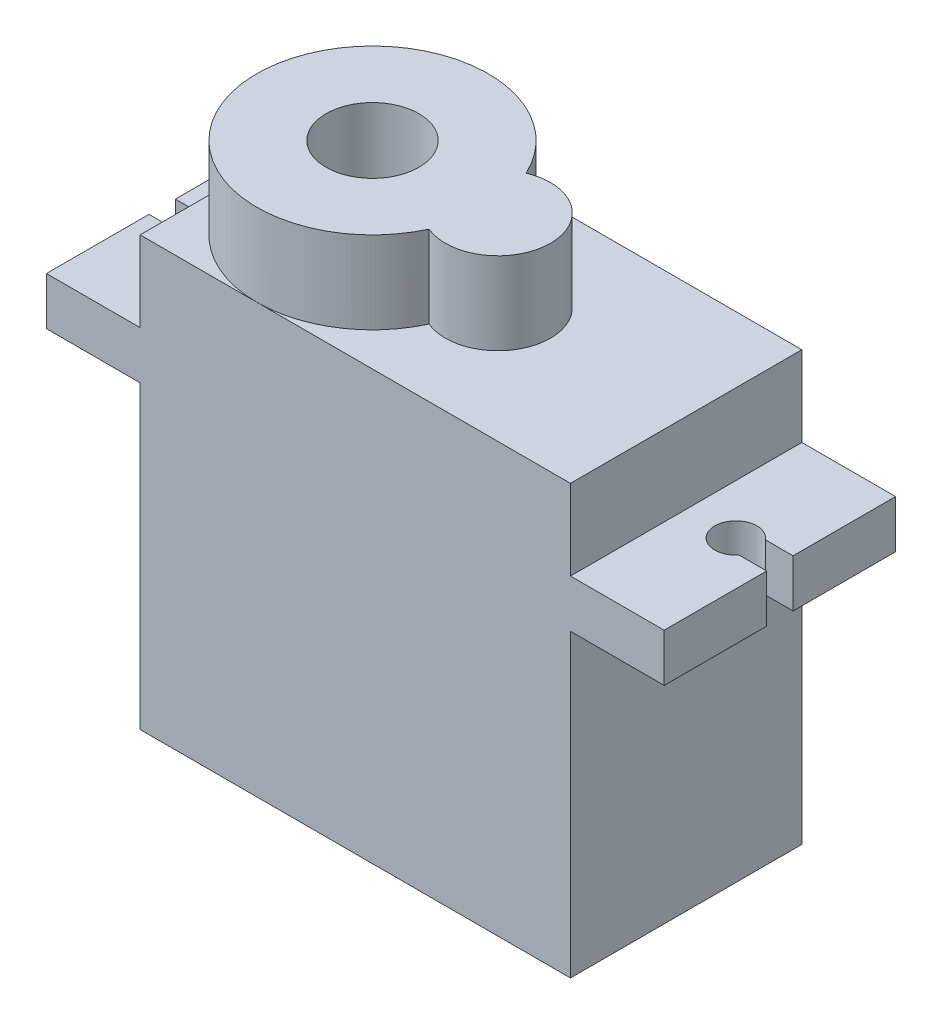
ISO-10303-21;
HEADER;
FILE_DESCRIPTION(('STEP AP214'),'2;1');
FILE_NAME('part.step','',(''),(''),'','','');
FILE_SCHEMA(('AUTOMOTIVE_DESIGN { 1 0 10303 214 1 1 1 1 }'));
ENDSEC;
DATA;
#1=APPLICATION_CONTEXT('core data for automotive mechanical design processes');
#2=APPLICATION_PROTOCOL_DEFINITION('international standard','automotive_design',2000,#1);
#3=PRODUCT_CONTEXT('',#1,'mechanical');
#4=PRODUCT('Part','Part','',(#3));
#5=PRODUCT_RELATED_PRODUCT_CATEGORY('part','',(#4));
#6=PRODUCT_DEFINITION_FORMATION('','',#4);
#7=PRODUCT_DEFINITION_CONTEXT('part definition',#1,'design');
#8=PRODUCT_DEFINITION('design','',#6,#7);
#9=PRODUCT_DEFINITION_SHAPE('','',#8);
#10=(LENGTH_UNIT() NAMED_UNIT(*) SI_UNIT(.MILLI.,.METRE.));
#11=(NAMED_UNIT(*) PLANE_ANGLE_UNIT() SI_UNIT($,.RADIAN.));
#12=(NAMED_UNIT(*) SI_UNIT($,.STERADIAN.) SOLID_ANGLE_UNIT());
#13=UNCERTAINTY_MEASURE_WITH_UNIT(LENGTH_MEASURE(1.E-05),#10,'distance_accuracy_value','');
#14=(GEOMETRIC_REPRESENTATION_CONTEXT(3) GLOBAL_UNCERTAINTY_ASSIGNED_CONTEXT((#13)) GLOBAL_UNIT_ASSIGNED_CONTEXT((#10,
#11,#12)) REPRESENTATION_CONTEXT('',''));
#15=CARTESIAN_POINT('',(0.,0.,0.));
#16=DIRECTION('',(0.,0.,1.));
#17=DIRECTION('',(1.,0.,0.));
#18=AXIS2_PLACEMENT_3D('',#15,#16,#17);
#19=CARTESIAN_POINT('',(0.,44.8,0.));
#20=DIRECTION('',(0.,-1.,0.));
#21=DIRECTION('',(0.,0.,-1.));
#22=AXIS2_PLACEMENT_3D('',#19,#20,#21);
#23=PLANE('',#22);
#24=CARTESIAN_POINT('',(2.81693698852337,44.8,0.));
#25=DIRECTION('',(0.,1.,0.));
#26=DIRECTION('',(0.,0.,1.));
#27=AXIS2_PLACEMENT_3D('',#24,#25,#26);
#28=CIRCLE('',#27,5.5);
#29=CARTESIAN_POINT('',(0.686331496944168,44.8,5.07055423393267));
#30=VERTEX_POINT('',#29);
#31=CARTESIAN_POINT('',(0.686331496944172,44.8,-5.07055423393267));
#32=VERTEX_POINT('',#31);
#33=EDGE_CURVE('E218',#30,#32,#28,.T.);
#34=ORIENTED_EDGE('',*,*,#33,.F.);
#35=CARTESIAN_POINT('',(-10.3,44.8,0.));
#36=DIRECTION('',(0.,1.,0.));
#37=DIRECTION('',(0.,0.,1.));
#38=AXIS2_PLACEMENT_3D('',#35,#36,#37);
#39=CIRCLE('',#38,12.1);
#40=CARTESIAN_POINT('',(-10.3,44.8,12.1));
#41=VERTEX_POINT('',#40);
#42=EDGE_CURVE('E53',#41,#30,#39,.T.);
#43=ORIENTED_EDGE('',*,*,#42,.F.);
#44=DIRECTION('',(1.,0.,0.));
#45=VECTOR('',#44,1.);
#46=CARTESIAN_POINT('',(-22.5,44.8,12.1));
#47=LINE('',#46,#45);
#48=CARTESIAN_POINT('',(22.5,44.8,12.1));
#49=VERTEX_POINT('',#48);
#50=EDGE_CURVE('E371',#41,#49,#47,.T.);
#51=ORIENTED_EDGE('',*,*,#50,.T.);
#52=DIRECTION('',(0.,0.,-1.));
#53=VECTOR('',#52,1.);
#54=CARTESIAN_POINT('',(22.5,44.8,12.1));
#55=LINE('',#54,#53);
#56=CARTESIAN_POINT('',(22.5,44.8,-12.1));
#57=VERTEX_POINT('',#56);
#58=EDGE_CURVE('E359',#49,#57,#55,.T.);
#59=ORIENTED_EDGE('',*,*,#58,.T.);
#60=DIRECTION('',(-1.,0.,0.));
#61=VECTOR('',#60,1.);
#62=CARTESIAN_POINT('',(-22.5,44.8,-12.1));
#63=LINE('',#62,#61);
#64=CARTESIAN_POINT('',(-10.3,44.8,-12.1));
#65=VERTEX_POINT('',#64);
#66=EDGE_CURVE('E365',#57,#65,#63,.T.);
#67=ORIENTED_EDGE('',*,*,#66,.T.);
#68=EDGE_CURVE('E55',#32,#65,#39,.T.);
#69=ORIENTED_EDGE('',*,*,#68,.F.);
#70=EDGE_LOOP('',(#34,#43,#51,#59,#67,#69));
#71=FACE_BOUND('',#70,.T.);
#72=ADVANCED_FACE('F43',(#71),#23,.F.);
#73=CARTESIAN_POINT('',(32.3,0.,0.));
#74=DIRECTION('',(-1.,0.,0.));
#75=DIRECTION('',(0.,0.,-1.));
#76=AXIS2_PLACEMENT_3D('',#73,#74,#75);
#77=PLANE('',#76);
#78=DIRECTION('',(0.,-1.,0.));
#79=VECTOR('',#78,1.);
#80=CARTESIAN_POINT('',(32.3,145.46840788497,1.38103253358551));
#81=LINE('',#80,#79);
#82=CARTESIAN_POINT('',(32.3,36.4,1.38103253358551));
#83=VERTEX_POINT('',#82);
#84=CARTESIAN_POINT('',(32.3,31.4,1.38103253358551));
#85=VERTEX_POINT('',#84);
#86=EDGE_CURVE('E220',#83,#85,#81,.T.);
#87=ORIENTED_EDGE('',*,*,#86,.F.);
#88=DIRECTION('',(0.,0.,-1.));
#89=VECTOR('',#88,1.);
#90=CARTESIAN_POINT('',(32.3,36.4,-12.1));
#91=LINE('',#90,#89);
#92=CARTESIAN_POINT('',(32.3,36.4,12.1));
#93=VERTEX_POINT('',#92);
#94=EDGE_CURVE('E259',#93,#83,#91,.T.);
#95=ORIENTED_EDGE('',*,*,#94,.F.);
#96=DIRECTION('',(0.,1.,0.));
#97=VECTOR('',#96,1.);
#98=CARTESIAN_POINT('',(32.3,31.4,12.1));
#99=LINE('',#98,#97);
#100=CARTESIAN_POINT('',(32.3,31.4,12.1));
#101=VERTEX_POINT('',#100);
#102=EDGE_CURVE('E263',#101,#93,#99,.T.);
#103=ORIENTED_EDGE('',*,*,#102,.F.);
#104=DIRECTION('',(0.,0.,1.));
#105=VECTOR('',#104,1.);
#106=CARTESIAN_POINT('',(32.3,31.4,-12.1));
#107=LINE('',#106,#105);
#108=EDGE_CURVE('E267',#85,#101,#107,.T.);
#109=ORIENTED_EDGE('',*,*,#108,.F.);
#110=EDGE_LOOP('',(#87,#95,#103,#109));
#111=FACE_BOUND('',#110,.T.);
#112=ADVANCED_FACE('F598',(#111),#77,.F.);
#113=CARTESIAN_POINT('',(22.5,44.8,12.1));
#114=DIRECTION('',(-1.,0.,0.));
#115=DIRECTION('',(0.,0.,1.));
#116=AXIS2_PLACEMENT_3D('',#113,#114,#115);
#117=PLANE('',#116);
#118=DIRECTION('',(0.,-1.,0.));
#119=VECTOR('',#118,1.);
#120=CARTESIAN_POINT('',(22.5,44.8,-12.1));
#121=LINE('',#120,#119);
#122=CARTESIAN_POINT('',(22.5,31.4,-12.1));
#123=VERTEX_POINT('',#122);
#124=CARTESIAN_POINT('',(22.5,0.,-12.1));
#125=VERTEX_POINT('',#124);
#126=EDGE_CURVE('E404',#123,#125,#121,.T.);
#127=ORIENTED_EDGE('',*,*,#126,.F.);
#128=DIRECTION('',(0.,0.,1.));
#129=VECTOR('',#128,1.);
#130=CARTESIAN_POINT('',(22.5,31.4,-12.1));
#131=LINE('',#130,#129);
#132=CARTESIAN_POINT('',(22.5,31.4,12.1));
#133=VERTEX_POINT('',#132);
#134=EDGE_CURVE('E258',#123,#133,#131,.T.);
#135=ORIENTED_EDGE('',*,*,#134,.T.);
#136=DIRECTION('',(0.,-1.,0.));
#137=VECTOR('',#136,1.);
#138=CARTESIAN_POINT('',(22.5,44.8,12.1));
#139=LINE('',#138,#137);
#140=CARTESIAN_POINT('',(22.5,0.,12.1));
#141=VERTEX_POINT('',#140);
#142=EDGE_CURVE('E376',#133,#141,#139,.T.);
#143=ORIENTED_EDGE('',*,*,#142,.T.);
#144=DIRECTION('',(0.,0.,-1.));
#145=VECTOR('',#144,1.);
#146=CARTESIAN_POINT('',(22.5,0.,12.1));
#147=LINE('',#146,#145);
#148=EDGE_CURVE('E358',#141,#125,#147,.T.);
#149=ORIENTED_EDGE('',*,*,#148,.T.);
#150=EDGE_LOOP('',(#127,#135,#143,#149));
#151=FACE_BOUND('',#150,.T.);
#152=ADVANCED_FACE('F502',(#151),#117,.F.);
#153=CARTESIAN_POINT('',(-32.3,0.,0.));
#154=DIRECTION('',(1.,0.,0.));
#155=DIRECTION('',(0.,0.,-1.));
#156=AXIS2_PLACEMENT_3D('',#153,#154,#155);
#157=PLANE('',#156);
#158=DIRECTION('',(0.,-1.,0.));
#159=VECTOR('',#158,1.);
#160=CARTESIAN_POINT('',(-32.3,129.905681645556,-1.38103253358552));
#161=LINE('',#160,#159);
#162=CARTESIAN_POINT('',(-32.3,36.4,-1.38103253358552));
#163=VERTEX_POINT('',#162);
#164=CARTESIAN_POINT('',(-32.3,31.4,-1.38103253358552));
#165=VERTEX_POINT('',#164);
#166=EDGE_CURVE('E301',#163,#165,#161,.T.);
#167=ORIENTED_EDGE('',*,*,#166,.F.);
#168=DIRECTION('',(0.,0.,-1.));
#169=VECTOR('',#168,1.);
#170=CARTESIAN_POINT('',(-32.3,36.4,-12.1));
#171=LINE('',#170,#169);
#172=CARTESIAN_POINT('',(-32.3,36.4,-12.1));
#173=VERTEX_POINT('',#172);
#174=EDGE_CURVE('E331',#163,#173,#171,.T.);
#175=ORIENTED_EDGE('',*,*,#174,.T.);
#176=DIRECTION('',(0.,-1.,0.));
#177=VECTOR('',#176,1.);
#178=CARTESIAN_POINT('',(-32.3,31.4,-12.1));
#179=LINE('',#178,#177);
#180=CARTESIAN_POINT('',(-32.3,31.4,-12.1));
#181=VERTEX_POINT('',#180);
#182=EDGE_CURVE('E318',#173,#181,#179,.T.);
#183=ORIENTED_EDGE('',*,*,#182,.T.);
#184=DIRECTION('',(0.,0.,1.));
#185=VECTOR('',#184,1.);
#186=CARTESIAN_POINT('',(-32.3,31.4,-12.1));
#187=LINE('',#186,#185);
#188=EDGE_CURVE('E324',#181,#165,#187,.T.);
#189=ORIENTED_EDGE('',*,*,#188,.T.);
#190=EDGE_LOOP('',(#167,#175,#183,#189));
#191=FACE_BOUND('',#190,.T.);
#192=ADVANCED_FACE('F660',(#191),#157,.F.);
#193=CARTESIAN_POINT('',(-32.3,31.4,-12.1));
#194=DIRECTION('',(0.,1.,0.));
#195=DIRECTION('',(0.,0.,1.));
#196=AXIS2_PLACEMENT_3D('',#193,#194,#195);
#197=PLANE('',#196);
#198=DIRECTION('',(1.,0.,0.));
#199=VECTOR('',#198,1.);
#200=CARTESIAN_POINT('',(-32.3,31.4,-1.38103253358552));
#201=LINE('',#200,#199);
#202=CARTESIAN_POINT('',(-29.4125271212972,31.4,-1.38103253358552));
#203=VERTEX_POINT('',#202);
#204=EDGE_CURVE('E313',#165,#203,#201,.T.);
#205=ORIENTED_EDGE('',*,*,#204,.F.);
#206=ORIENTED_EDGE('',*,*,#188,.F.);
#207=DIRECTION('',(1.,0.,0.));
#208=VECTOR('',#207,1.);
#209=CARTESIAN_POINT('',(-32.3,31.4,-12.1));
#210=LINE('',#209,#208);
#211=CARTESIAN_POINT('',(-22.5,31.4,-12.1));
#212=VERTEX_POINT('',#211);
#213=EDGE_CURVE('E354',#181,#212,#210,.T.);
#214=ORIENTED_EDGE('',*,*,#213,.T.);
#215=DIRECTION('',(0.,0.,1.));
#216=VECTOR('',#215,1.);
#217=CARTESIAN_POINT('',(-22.5,31.4,-12.1));
#218=LINE('',#217,#216);
#219=CARTESIAN_POINT('',(-22.5,31.4,12.1));
#220=VERTEX_POINT('',#219);
#221=EDGE_CURVE('E317',#212,#220,#218,.T.);
#222=ORIENTED_EDGE('',*,*,#221,.T.);
#223=DIRECTION('',(1.,0.,0.));
#224=VECTOR('',#223,1.);
#225=CARTESIAN_POINT('',(-32.3,31.4,12.1));
#226=LINE('',#225,#224);
#227=CARTESIAN_POINT('',(-32.3,31.4,12.1));
#228=VERTEX_POINT('',#227);
#229=EDGE_CURVE('E350',#228,#220,#226,.T.);
#230=ORIENTED_EDGE('',*,*,#229,.F.);
#231=CARTESIAN_POINT('',(-32.3,31.4,1.38103253358551));
#232=VERTEX_POINT('',#231);
#233=EDGE_CURVE('E322',#232,#228,#187,.T.);
#234=ORIENTED_EDGE('',*,*,#233,.F.);
#235=DIRECTION('',(-1.,0.,0.));
#236=VECTOR('',#235,1.);
#237=CARTESIAN_POINT('',(-32.3,31.4,1.38103253358551));
#238=LINE('',#237,#236);
#239=CARTESIAN_POINT('',(-29.4125271212972,31.4,1.38103253358551));
#240=VERTEX_POINT('',#239);
#241=EDGE_CURVE('E305',#240,#232,#238,.T.);
#242=ORIENTED_EDGE('',*,*,#241,.F.);
#243=CARTESIAN_POINT('',(-27.7,31.4,0.));
#244=DIRECTION('',(0.,1.,0.));
#245=DIRECTION('',(0.,0.,1.));
#246=AXIS2_PLACEMENT_3D('',#243,#244,#245);
#247=CIRCLE('',#246,2.2);
#248=EDGE_CURVE('E309',#203,#240,#247,.F.);
#249=ORIENTED_EDGE('',*,*,#248,.F.);
#250=EDGE_LOOP('',(#205,#206,#214,#222,#230,#234,#242,#249));
#251=FACE_BOUND('',#250,.T.);
#252=ADVANCED_FACE('F653',(#251),#197,.F.);
#253=CARTESIAN_POINT('',(-32.3,36.4,-12.1));
#254=DIRECTION('',(0.,-1.,0.));
#255=DIRECTION('',(0.,0.,-1.));
#256=AXIS2_PLACEMENT_3D('',#253,#254,#255);
#257=PLANE('',#256);
#258=DIRECTION('',(-1.,0.,0.));
#259=VECTOR('',#258,1.);
#260=CARTESIAN_POINT('',(-32.3,36.4,-1.38103253358552));
#261=LINE('',#260,#259);
#262=CARTESIAN_POINT('',(-29.4125271212972,36.4,-1.38103253358552));
#263=VERTEX_POINT('',#262);
#264=EDGE_CURVE('E417',#263,#163,#261,.T.);
#265=ORIENTED_EDGE('',*,*,#264,.F.);
#266=CARTESIAN_POINT('',(-27.7,36.4,0.));
#267=DIRECTION('',(0.,-1.,0.));
#268=DIRECTION('',(0.,0.,-1.));
#269=AXIS2_PLACEMENT_3D('',#266,#267,#268);
#270=CIRCLE('',#269,2.2);
#271=CARTESIAN_POINT('',(-29.4125271212972,36.4,1.38103253358551));
#272=VERTEX_POINT('',#271);
#273=EDGE_CURVE('E413',#272,#263,#270,.F.);
#274=ORIENTED_EDGE('',*,*,#273,.F.);
#275=DIRECTION('',(1.,0.,0.));
#276=VECTOR('',#275,1.);
#277=CARTESIAN_POINT('',(-32.3,36.4,1.38103253358551));
#278=LINE('',#277,#276);
#279=CARTESIAN_POINT('',(-32.3,36.4,1.38103253358551));
#280=VERTEX_POINT('',#279);
#281=EDGE_CURVE('E409',#280,#272,#278,.T.);
#282=ORIENTED_EDGE('',*,*,#281,.F.);
#283=CARTESIAN_POINT('',(-32.3,36.4,12.1));
#284=VERTEX_POINT('',#283);
#285=EDGE_CURVE('E332',#284,#280,#171,.T.);
#286=ORIENTED_EDGE('',*,*,#285,.F.);
#287=DIRECTION('',(1.,0.,0.));
#288=VECTOR('',#287,1.);
#289=CARTESIAN_POINT('',(-32.3,36.4,12.1));
#290=LINE('',#289,#288);
#291=CARTESIAN_POINT('',(-22.5,36.4,12.1));
#292=VERTEX_POINT('',#291);
#293=EDGE_CURVE('E346',#284,#292,#290,.T.);
#294=ORIENTED_EDGE('',*,*,#293,.T.);
#295=DIRECTION('',(0.,0.,-1.));
#296=VECTOR('',#295,1.);
#297=CARTESIAN_POINT('',(-22.5,36.4,-12.1));
#298=LINE('',#297,#296);
#299=CARTESIAN_POINT('',(-22.5,36.4,-12.1));
#300=VERTEX_POINT('',#299);
#301=EDGE_CURVE('E323',#292,#300,#298,.T.);
#302=ORIENTED_EDGE('',*,*,#301,.T.);
#303=DIRECTION('',(1.,0.,0.));
#304=VECTOR('',#303,1.);
#305=CARTESIAN_POINT('',(-32.3,36.4,-12.1));
#306=LINE('',#305,#304);
#307=EDGE_CURVE('E336',#173,#300,#306,.T.);
#308=ORIENTED_EDGE('',*,*,#307,.F.);
#309=ORIENTED_EDGE('',*,*,#174,.F.);
#310=EDGE_LOOP('',(#265,#274,#282,#286,#294,#302,#308,#309));
#311=FACE_BOUND('',#310,.T.);
#312=ADVANCED_FACE('F644',(#311),#257,.F.);
#313=CARTESIAN_POINT('',(-22.5,44.8,12.1));
#314=DIRECTION('',(1.,0.,0.));
#315=DIRECTION('',(0.,0.,-1.));
#316=AXIS2_PLACEMENT_3D('',#313,#314,#315);
#317=PLANE('',#316);
#318=ORIENTED_EDGE('',*,*,#301,.F.);
#319=DIRECTION('',(0.,-1.,0.));
#320=VECTOR('',#319,1.);
#321=CARTESIAN_POINT('',(-22.5,44.8,12.1));
#322=LINE('',#321,#320);
#323=CARTESIAN_POINT('',(-22.5,44.8,12.1));
#324=VERTEX_POINT('',#323);
#325=EDGE_CURVE('E396',#324,#292,#322,.T.);
#326=ORIENTED_EDGE('',*,*,#325,.F.);
#327=DIRECTION('',(0.,0.,1.));
#328=VECTOR('',#327,1.);
#329=CARTESIAN_POINT('',(-22.5,44.8,12.1));
#330=LINE('',#329,#328);
#331=CARTESIAN_POINT('',(-22.5,44.8,-12.1));
#332=VERTEX_POINT('',#331);
#333=EDGE_CURVE('E368',#332,#324,#330,.T.);
#334=ORIENTED_EDGE('',*,*,#333,.F.);
#335=DIRECTION('',(0.,-1.,0.));
#336=VECTOR('',#335,1.);
#337=CARTESIAN_POINT('',(-22.5,44.8,-12.1));
#338=LINE('',#337,#336);
#339=EDGE_CURVE('E401',#332,#300,#338,.T.);
#340=ORIENTED_EDGE('',*,*,#339,.T.);
#341=EDGE_LOOP('',(#318,#326,#334,#340));
#342=FACE_BOUND('',#341,.T.);
#343=ADVANCED_FACE('F868',(#342),#317,.F.);
#344=ORIENTED_EDGE('',*,*,#221,.F.);
#345=CARTESIAN_POINT('',(-22.5,0.,-12.1));
#346=VERTEX_POINT('',#345);
#347=EDGE_CURVE('E400',#212,#346,#338,.T.);
#348=ORIENTED_EDGE('',*,*,#347,.T.);
#349=DIRECTION('',(0.,0.,1.));
#350=VECTOR('',#349,1.);
#351=CARTESIAN_POINT('',(-22.5,0.,12.1));
#352=LINE('',#351,#350);
#353=CARTESIAN_POINT('',(-22.5,0.,12.1));
#354=VERTEX_POINT('',#353);
#355=EDGE_CURVE('E384',#346,#354,#352,.T.);
#356=ORIENTED_EDGE('',*,*,#355,.T.);
#357=EDGE_CURVE('E395',#220,#354,#322,.T.);
#358=ORIENTED_EDGE('',*,*,#357,.F.);
#359=EDGE_LOOP('',(#344,#348,#356,#358));
#360=FACE_BOUND('',#359,.T.);
#361=ADVANCED_FACE('F513',(#360),#317,.F.);
#362=CARTESIAN_POINT('',(22.5,36.4,12.1));
#363=VERTEX_POINT('',#362);
#364=EDGE_CURVE('E391',#49,#363,#139,.T.);
#365=ORIENTED_EDGE('',*,*,#364,.T.);
#366=DIRECTION('',(0.,0.,-1.));
#367=VECTOR('',#366,1.);
#368=CARTESIAN_POINT('',(22.5,36.4,-12.1));
#369=LINE('',#368,#367);
#370=CARTESIAN_POINT('',(22.5,36.4,-12.1));
#371=VERTEX_POINT('',#370);
#372=EDGE_CURVE('E252',#363,#371,#369,.T.);
#373=ORIENTED_EDGE('',*,*,#372,.T.);
#374=EDGE_CURVE('E405',#57,#371,#121,.T.);
#375=ORIENTED_EDGE('',*,*,#374,.F.);
#376=ORIENTED_EDGE('',*,*,#58,.F.);
#377=EDGE_LOOP('',(#365,#373,#375,#376));
#378=FACE_BOUND('',#377,.T.);
#379=ADVANCED_FACE('F45',(#378),#117,.F.);
#380=CARTESIAN_POINT('',(-22.5,44.8,-12.1));
#381=DIRECTION('',(0.,0.,1.));
#382=DIRECTION('',(1.,0.,0.));
#383=AXIS2_PLACEMENT_3D('',#380,#381,#382);
#384=PLANE('',#383);
#385=DIRECTION('',(-1.,0.,0.));
#386=VECTOR('',#385,1.);
#387=CARTESIAN_POINT('',(-22.5,0.,-12.1));
#388=LINE('',#387,#386);
#389=EDGE_CURVE('E380',#125,#346,#388,.T.);
#390=ORIENTED_EDGE('',*,*,#389,.T.);
#391=ORIENTED_EDGE('',*,*,#347,.F.);
#392=ORIENTED_EDGE('',*,*,#213,.F.);
#393=ORIENTED_EDGE('',*,*,#182,.F.);
#394=ORIENTED_EDGE('',*,*,#307,.T.);
#395=ORIENTED_EDGE('',*,*,#339,.F.);
#396=EDGE_CURVE('E363',#65,#332,#63,.T.);
#397=ORIENTED_EDGE('',*,*,#396,.F.);
#398=ORIENTED_EDGE('',*,*,#66,.F.);
#399=ORIENTED_EDGE('',*,*,#374,.T.);
#400=DIRECTION('',(-1.,0.,0.));
#401=VECTOR('',#400,1.);
#402=CARTESIAN_POINT('',(32.3,36.4,-12.1));
#403=LINE('',#402,#401);
#404=CARTESIAN_POINT('',(32.3,36.4,-12.1));
#405=VERTEX_POINT('',#404);
#406=EDGE_CURVE('E287',#405,#371,#403,.T.);
#407=ORIENTED_EDGE('',*,*,#406,.F.);
#408=DIRECTION('',(0.,-1.,0.));
#409=VECTOR('',#408,1.);
#410=CARTESIAN_POINT('',(32.3,31.4,-12.1));
#411=LINE('',#410,#409);
#412=CARTESIAN_POINT('',(32.3,31.4,-12.1));
#413=VERTEX_POINT('',#412);
#414=EDGE_CURVE('E253',#405,#413,#411,.T.);
#415=ORIENTED_EDGE('',*,*,#414,.T.);
#416=DIRECTION('',(-1.,0.,0.));
#417=VECTOR('',#416,1.);
#418=CARTESIAN_POINT('',(32.3,31.4,-12.1));
#419=LINE('',#418,#417);
#420=EDGE_CURVE('E272',#413,#123,#419,.T.);
#421=ORIENTED_EDGE('',*,*,#420,.T.);
#422=ORIENTED_EDGE('',*,*,#126,.T.);
#423=EDGE_LOOP('',(#390,#391,#392,#393,#394,#395,#397,#398,#399,#407,#415,#421,#422));
#424=FACE_BOUND('',#423,.T.);
#425=ADVANCED_FACE('F518',(#424),#384,.F.);
#426=CARTESIAN_POINT('',(-22.5,44.8,12.1));
#427=DIRECTION('',(0.,0.,-1.));
#428=DIRECTION('',(-1.,0.,0.));
#429=AXIS2_PLACEMENT_3D('',#426,#427,#428);
#430=PLANE('',#429);
#431=DIRECTION('',(1.,0.,0.));
#432=VECTOR('',#431,1.);
#433=CARTESIAN_POINT('',(-22.5,0.,12.1));
#434=LINE('',#433,#432);
#435=EDGE_CURVE('E364',#354,#141,#434,.T.);
#436=ORIENTED_EDGE('',*,*,#435,.T.);
#437=ORIENTED_EDGE('',*,*,#142,.F.);
#438=DIRECTION('',(-1.,0.,0.));
#439=VECTOR('',#438,1.);
#440=CARTESIAN_POINT('',(32.3,31.4,12.1));
#441=LINE('',#440,#439);
#442=EDGE_CURVE('E281',#101,#133,#441,.T.);
#443=ORIENTED_EDGE('',*,*,#442,.F.);
#444=ORIENTED_EDGE('',*,*,#102,.T.);
#445=DIRECTION('',(-1.,0.,0.));
#446=VECTOR('',#445,1.);
#447=CARTESIAN_POINT('',(32.3,36.4,12.1));
#448=LINE('',#447,#446);
#449=EDGE_CURVE('E284',#93,#363,#448,.T.);
#450=ORIENTED_EDGE('',*,*,#449,.T.);
#451=ORIENTED_EDGE('',*,*,#364,.F.);
#452=ORIENTED_EDGE('',*,*,#50,.F.);
#453=EDGE_CURVE('E372',#324,#41,#47,.T.);
#454=ORIENTED_EDGE('',*,*,#453,.F.);
#455=ORIENTED_EDGE('',*,*,#325,.T.);
#456=ORIENTED_EDGE('',*,*,#293,.F.);
#457=DIRECTION('',(0.,1.,0.));
#458=VECTOR('',#457,1.);
#459=CARTESIAN_POINT('',(-32.3,31.4,12.1));
#460=LINE('',#459,#458);
#461=EDGE_CURVE('E328',#228,#284,#460,.T.);
#462=ORIENTED_EDGE('',*,*,#461,.F.);
#463=ORIENTED_EDGE('',*,*,#229,.T.);
#464=ORIENTED_EDGE('',*,*,#357,.T.);
#465=EDGE_LOOP('',(#436,#437,#443,#444,#450,#451,#452,#454,#455,#456,#462,#463,#464));
#466=FACE_BOUND('',#465,.T.);
#467=ADVANCED_FACE('F508',(#466),#430,.F.);
#468=EDGE_CURVE('E11',#65,#41,#39,.T.);
#469=ORIENTED_EDGE('',*,*,#468,.F.);
#470=ORIENTED_EDGE('',*,*,#396,.T.);
#471=ORIENTED_EDGE('',*,*,#333,.T.);
#472=ORIENTED_EDGE('',*,*,#453,.T.);
#473=EDGE_LOOP('',(#469,#470,#471,#472));
#474=FACE_BOUND('',#473,.T.);
#475=ADVANCED_FACE('F491',(#474),#23,.F.);
#476=CARTESIAN_POINT('',(0.,0.,0.));
#477=DIRECTION('',(0.,-1.,0.));
#478=DIRECTION('',(0.,0.,-1.));
#479=AXIS2_PLACEMENT_3D('',#476,#477,#478);
#480=PLANE('',#479);
#481=CARTESIAN_POINT('',(-20.5,0.,-10.1));
#482=DIRECTION('',(0.,-1.,0.));
#483=DIRECTION('',(0.,0.,-1.));
#484=AXIS2_PLACEMENT_3D('',#481,#482,#483);
#485=CIRCLE('',#484,1.5);
#486=CARTESIAN_POINT('',(-20.5,0.,-11.6));
#487=VERTEX_POINT('',#486);
#488=EDGE_CURVE('E464',#487,#487,#485,.T.);
#489=ORIENTED_EDGE('',*,*,#488,.F.);
#490=EDGE_LOOP('',(#489));
#491=FACE_BOUND('',#490,.T.);
#492=CARTESIAN_POINT('',(20.5,0.,-10.1));
#493=DIRECTION('',(0.,-1.,0.));
#494=DIRECTION('',(0.,0.,-1.));
#495=AXIS2_PLACEMENT_3D('',#492,#493,#494);
#496=CIRCLE('',#495,1.5);
#497=CARTESIAN_POINT('',(20.5,0.,-11.6));
#498=VERTEX_POINT('',#497);
#499=EDGE_CURVE('E472',#498,#498,#496,.T.);
#500=ORIENTED_EDGE('',*,*,#499,.F.);
#501=EDGE_LOOP('',(#500));
#502=FACE_BOUND('',#501,.T.);
#503=CARTESIAN_POINT('',(20.5,0.,10.1));
#504=DIRECTION('',(0.,-1.,0.));
#505=DIRECTION('',(0.,0.,-1.));
#506=AXIS2_PLACEMENT_3D('',#503,#504,#505);
#507=CIRCLE('',#506,1.5);
#508=CARTESIAN_POINT('',(20.5,0.,8.6));
#509=VERTEX_POINT('',#508);
#510=EDGE_CURVE('E456',#509,#509,#507,.T.);
#511=ORIENTED_EDGE('',*,*,#510,.F.);
#512=EDGE_LOOP('',(#511));
#513=FACE_BOUND('',#512,.T.);
#514=CARTESIAN_POINT('',(-20.5,0.,10.1));
#515=DIRECTION('',(0.,-1.,0.));
#516=DIRECTION('',(0.,0.,-1.));
#517=AXIS2_PLACEMENT_3D('',#514,#515,#516);
#518=CIRCLE('',#517,1.5);
#519=CARTESIAN_POINT('',(-20.5,0.,8.6));
#520=VERTEX_POINT('',#519);
#521=EDGE_CURVE('E452',#520,#520,#518,.T.);
#522=ORIENTED_EDGE('',*,*,#521,.F.);
#523=EDGE_LOOP('',(#522));
#524=FACE_BOUND('',#523,.T.);
#525=ORIENTED_EDGE('',*,*,#148,.F.);
#526=ORIENTED_EDGE('',*,*,#435,.F.);
#527=ORIENTED_EDGE('',*,*,#355,.F.);
#528=ORIENTED_EDGE('',*,*,#389,.F.);
#529=EDGE_LOOP('',(#525,#526,#527,#528));
#530=FACE_BOUND('',#529,.T.);
#531=ADVANCED_FACE('F487',(#491,#502,#513,#524,#530),#480,.T.);
#532=ORIENTED_EDGE('',*,*,#285,.T.);
#533=DIRECTION('',(0.,-1.,0.));
#534=VECTOR('',#533,1.);
#535=CARTESIAN_POINT('',(-32.3,129.905681645556,1.38103253358551));
#536=LINE('',#535,#534);
#537=EDGE_CURVE('E290',#280,#232,#536,.T.);
#538=ORIENTED_EDGE('',*,*,#537,.T.);
#539=ORIENTED_EDGE('',*,*,#233,.T.);
#540=ORIENTED_EDGE('',*,*,#461,.T.);
#541=EDGE_LOOP('',(#532,#538,#539,#540));
#542=FACE_BOUND('',#541,.T.);
#543=ADVANCED_FACE('F490',(#542),#157,.F.);
#544=CARTESIAN_POINT('',(-32.3,129.905681645556,-1.38103253358552));
#545=DIRECTION('',(0.,0.,1.));
#546=DIRECTION('',(1.,0.,0.));
#547=AXIS2_PLACEMENT_3D('',#544,#545,#546);
#548=PLANE('',#547);
#549=ORIENTED_EDGE('',*,*,#166,.T.);
#550=ORIENTED_EDGE('',*,*,#204,.T.);
#551=DIRECTION('',(0.,-1.,0.));
#552=VECTOR('',#551,1.);
#553=CARTESIAN_POINT('',(-29.4125271212972,129.905681645556,-1.38103253358552));
#554=LINE('',#553,#552);
#555=EDGE_CURVE('E297',#263,#203,#554,.T.);
#556=ORIENTED_EDGE('',*,*,#555,.F.);
#557=ORIENTED_EDGE('',*,*,#264,.T.);
#558=EDGE_LOOP('',(#549,#550,#556,#557));
#559=FACE_BOUND('',#558,.T.);
#560=ADVANCED_FACE('F658',(#559),#548,.T.);
#561=CARTESIAN_POINT('',(-27.7,129.905681645556,0.));
#562=DIRECTION('',(0.,-1.,0.));
#563=DIRECTION('',(0.,0.,-1.));
#564=AXIS2_PLACEMENT_3D('',#561,#562,#563);
#565=CYLINDRICAL_SURFACE('',#564,2.2);
#566=ORIENTED_EDGE('',*,*,#555,.T.);
#567=ORIENTED_EDGE('',*,*,#248,.T.);
#568=DIRECTION('',(0.,-1.,0.));
#569=VECTOR('',#568,1.);
#570=CARTESIAN_POINT('',(-29.4125271212972,129.905681645556,1.38103253358551));
#571=LINE('',#570,#569);
#572=EDGE_CURVE('E293',#272,#240,#571,.T.);
#573=ORIENTED_EDGE('',*,*,#572,.F.);
#574=ORIENTED_EDGE('',*,*,#273,.T.);
#575=EDGE_LOOP('',(#566,#567,#573,#574));
#576=FACE_BOUND('',#575,.T.);
#577=ADVANCED_FACE('F655',(#576),#565,.F.);
#578=CARTESIAN_POINT('',(-32.3,129.905681645556,1.38103253358551));
#579=DIRECTION('',(0.,0.,-1.));
#580=DIRECTION('',(-1.,0.,0.));
#581=AXIS2_PLACEMENT_3D('',#578,#579,#580);
#582=PLANE('',#581);
#583=ORIENTED_EDGE('',*,*,#572,.T.);
#584=ORIENTED_EDGE('',*,*,#241,.T.);
#585=ORIENTED_EDGE('',*,*,#537,.F.);
#586=ORIENTED_EDGE('',*,*,#281,.T.);
#587=EDGE_LOOP('',(#583,#584,#585,#586));
#588=FACE_BOUND('',#587,.T.);
#589=ADVANCED_FACE('F650',(#588),#582,.T.);
#590=CARTESIAN_POINT('',(32.3,36.4,-12.1));
#591=DIRECTION('',(0.,1.,0.));
#592=DIRECTION('',(0.,0.,1.));
#593=AXIS2_PLACEMENT_3D('',#590,#591,#592);
#594=PLANE('',#593);
#595=DIRECTION('',(-1.,0.,0.));
#596=VECTOR('',#595,1.);
#597=CARTESIAN_POINT('',(32.3,36.4,-1.38103253358552));
#598=LINE('',#597,#596);
#599=CARTESIAN_POINT('',(32.3,36.4,-1.38103253358552));
#600=VERTEX_POINT('',#599);
#601=CARTESIAN_POINT('',(29.4125271212972,36.4,-1.38103253358552));
#602=VERTEX_POINT('',#601);
#603=EDGE_CURVE('E248',#600,#602,#598,.T.);
#604=ORIENTED_EDGE('',*,*,#603,.F.);
#605=EDGE_CURVE('E257',#600,#405,#91,.T.);
#606=ORIENTED_EDGE('',*,*,#605,.T.);
#607=ORIENTED_EDGE('',*,*,#406,.T.);
#608=ORIENTED_EDGE('',*,*,#372,.F.);
#609=ORIENTED_EDGE('',*,*,#449,.F.);
#610=ORIENTED_EDGE('',*,*,#94,.T.);
#611=DIRECTION('',(1.,0.,0.));
#612=VECTOR('',#611,1.);
#613=CARTESIAN_POINT('',(32.3,36.4,1.38103253358551));
#614=LINE('',#613,#612);
#615=CARTESIAN_POINT('',(29.4125271212972,36.4,1.38103253358551));
#616=VERTEX_POINT('',#615);
#617=EDGE_CURVE('E240',#616,#83,#614,.T.);
#618=ORIENTED_EDGE('',*,*,#617,.F.);
#619=CARTESIAN_POINT('',(27.7,36.4,0.));
#620=DIRECTION('',(0.,1.,0.));
#621=DIRECTION('',(0.,0.,1.));
#622=AXIS2_PLACEMENT_3D('',#619,#620,#621);
#623=CIRCLE('',#622,2.2);
#624=EDGE_CURVE('E244',#602,#616,#623,.T.);
#625=ORIENTED_EDGE('',*,*,#624,.F.);
#626=EDGE_LOOP('',(#604,#606,#607,#608,#609,#610,#618,#625));
#627=FACE_BOUND('',#626,.T.);
#628=ADVANCED_FACE('F585',(#627),#594,.T.);
#629=CARTESIAN_POINT('',(32.3,31.4,-12.1));
#630=DIRECTION('',(0.,-1.,0.));
#631=DIRECTION('',(0.,0.,-1.));
#632=AXIS2_PLACEMENT_3D('',#629,#630,#631);
#633=PLANE('',#632);
#634=DIRECTION('',(1.,0.,0.));
#635=VECTOR('',#634,1.);
#636=CARTESIAN_POINT('',(32.3,31.4,-1.38103253358552));
#637=LINE('',#636,#635);
#638=CARTESIAN_POINT('',(29.4125271212972,31.4,-1.38103253358552));
#639=VERTEX_POINT('',#638);
#640=CARTESIAN_POINT('',(32.3,31.4,-1.38103253358552));
#641=VERTEX_POINT('',#640);
#642=EDGE_CURVE('E47',#639,#641,#637,.T.);
#643=ORIENTED_EDGE('',*,*,#642,.F.);
#644=CARTESIAN_POINT('',(27.7,31.4,0.));
#645=DIRECTION('',(0.,-1.,0.));
#646=DIRECTION('',(0.,0.,-1.));
#647=AXIS2_PLACEMENT_3D('',#644,#645,#646);
#648=CIRCLE('',#647,2.2);
#649=CARTESIAN_POINT('',(29.4125271212972,31.4,1.38103253358551));
#650=VERTEX_POINT('',#649);
#651=EDGE_CURVE('E424',#650,#639,#648,.T.);
#652=ORIENTED_EDGE('',*,*,#651,.F.);
#653=DIRECTION('',(-1.,0.,0.));
#654=VECTOR('',#653,1.);
#655=CARTESIAN_POINT('',(32.3,31.4,1.38103253358551));
#656=LINE('',#655,#654);
#657=EDGE_CURVE('E421',#85,#650,#656,.T.);
#658=ORIENTED_EDGE('',*,*,#657,.F.);
#659=ORIENTED_EDGE('',*,*,#108,.T.);
#660=ORIENTED_EDGE('',*,*,#442,.T.);
#661=ORIENTED_EDGE('',*,*,#134,.F.);
#662=ORIENTED_EDGE('',*,*,#420,.F.);
#663=EDGE_CURVE('E268',#413,#641,#107,.T.);
#664=ORIENTED_EDGE('',*,*,#663,.T.);
#665=EDGE_LOOP('',(#643,#652,#658,#659,#660,#661,#662,#664));
#666=FACE_BOUND('',#665,.T.);
#667=ADVANCED_FACE('F593',(#666),#633,.T.);
#668=ORIENTED_EDGE('',*,*,#605,.F.);
#669=DIRECTION('',(0.,-1.,0.));
#670=VECTOR('',#669,1.);
#671=CARTESIAN_POINT('',(32.3,145.46840788497,-1.38103253358552));
#672=LINE('',#671,#670);
#673=EDGE_CURVE('E237',#600,#641,#672,.T.);
#674=ORIENTED_EDGE('',*,*,#673,.T.);
#675=ORIENTED_EDGE('',*,*,#663,.F.);
#676=ORIENTED_EDGE('',*,*,#414,.F.);
#677=EDGE_LOOP('',(#668,#674,#675,#676));
#678=FACE_BOUND('',#677,.T.);
#679=ADVANCED_FACE('F591',(#678),#77,.F.);
#680=CARTESIAN_POINT('',(32.3,145.46840788497,-1.38103253358552));
#681=DIRECTION('',(0.,0.,-1.));
#682=DIRECTION('',(-1.,0.,0.));
#683=AXIS2_PLACEMENT_3D('',#680,#681,#682);
#684=PLANE('',#683);
#685=ORIENTED_EDGE('',*,*,#673,.F.);
#686=ORIENTED_EDGE('',*,*,#603,.T.);
#687=DIRECTION('',(0.,-1.,0.));
#688=VECTOR('',#687,1.);
#689=CARTESIAN_POINT('',(29.4125271212972,145.46840788497,-1.38103253358552));
#690=LINE('',#689,#688);
#691=EDGE_CURVE('E233',#602,#639,#690,.T.);
#692=ORIENTED_EDGE('',*,*,#691,.T.);
#693=ORIENTED_EDGE('',*,*,#642,.T.);
#694=EDGE_LOOP('',(#685,#686,#692,#693));
#695=FACE_BOUND('',#694,.T.);
#696=ADVANCED_FACE('F603',(#695),#684,.F.);
#697=CARTESIAN_POINT('',(27.7,145.46840788497,0.));
#698=DIRECTION('',(0.,-1.,0.));
#699=DIRECTION('',(0.,0.,-1.));
#700=AXIS2_PLACEMENT_3D('',#697,#698,#699);
#701=CYLINDRICAL_SURFACE('',#700,2.2);
#702=ORIENTED_EDGE('',*,*,#691,.F.);
#703=ORIENTED_EDGE('',*,*,#624,.T.);
#704=DIRECTION('',(0.,-1.,0.));
#705=VECTOR('',#704,1.);
#706=CARTESIAN_POINT('',(29.4125271212972,145.46840788497,1.38103253358551));
#707=LINE('',#706,#705);
#708=EDGE_CURVE('E226',#616,#650,#707,.T.);
#709=ORIENTED_EDGE('',*,*,#708,.T.);
#710=ORIENTED_EDGE('',*,*,#651,.T.);
#711=EDGE_LOOP('',(#702,#703,#709,#710));
#712=FACE_BOUND('',#711,.T.);
#713=ADVANCED_FACE('F602',(#712),#701,.F.);
#714=CARTESIAN_POINT('',(32.3,145.46840788497,1.38103253358551));
#715=DIRECTION('',(0.,0.,1.));
#716=DIRECTION('',(1.,0.,0.));
#717=AXIS2_PLACEMENT_3D('',#714,#715,#716);
#718=PLANE('',#717);
#719=ORIENTED_EDGE('',*,*,#708,.F.);
#720=ORIENTED_EDGE('',*,*,#617,.T.);
#721=ORIENTED_EDGE('',*,*,#86,.T.);
#722=ORIENTED_EDGE('',*,*,#657,.T.);
#723=EDGE_LOOP('',(#719,#720,#721,#722));
#724=FACE_BOUND('',#723,.T.);
#725=ADVANCED_FACE('F601',(#724),#718,.F.);
#726=CARTESIAN_POINT('',(-3.74153150573831,53.4,0.));
#727=DIRECTION('',(0.,1.,0.));
#728=DIRECTION('',(0.,0.,1.));
#729=AXIS2_PLACEMENT_3D('',#726,#727,#728);
#730=PLANE('',#729);
#731=CARTESIAN_POINT('',(2.81693698852337,53.4,0.));
#732=DIRECTION('',(0.,1.,0.));
#733=DIRECTION('',(0.,0.,1.));
#734=AXIS2_PLACEMENT_3D('',#731,#732,#733);
#735=CIRCLE('',#734,5.5);
#736=CARTESIAN_POINT('',(0.686331496944168,53.4,5.07055423393267));
#737=VERTEX_POINT('',#736);
#738=CARTESIAN_POINT('',(0.686331496944172,53.4,-5.07055423393267));
#739=VERTEX_POINT('',#738);
#740=EDGE_CURVE('E210',#737,#739,#735,.T.);
#741=ORIENTED_EDGE('',*,*,#740,.T.);
#742=CARTESIAN_POINT('',(-10.3,53.4,0.));
#743=DIRECTION('',(0.,1.,0.));
#744=DIRECTION('',(0.,0.,1.));
#745=AXIS2_PLACEMENT_3D('',#742,#743,#744);
#746=CIRCLE('',#745,12.1);
#747=EDGE_CURVE('E199',#739,#737,#746,.T.);
#748=ORIENTED_EDGE('',*,*,#747,.T.);
#749=EDGE_LOOP('',(#741,#748));
#750=FACE_BOUND('',#749,.T.);
#751=CARTESIAN_POINT('',(-10.3,53.4,0.));
#752=DIRECTION('',(0.,1.,0.));
#753=DIRECTION('',(0.,0.,1.));
#754=AXIS2_PLACEMENT_3D('',#751,#752,#753);
#755=CIRCLE('',#754,4.86);
#756=CARTESIAN_POINT('',(-10.3,53.4,-4.86));
#757=VERTEX_POINT('',#756);
#758=EDGE_CURVE('E441',#757,#757,#755,.T.);
#759=ORIENTED_EDGE('',*,*,#758,.F.);
#760=EDGE_LOOP('',(#759));
#761=FACE_BOUND('',#760,.T.);
#762=ADVANCED_FACE('F212',(#750,#761),#730,.T.);
#763=CARTESIAN_POINT('',(2.81693698852337,53.4,0.));
#764=DIRECTION('',(0.,-1.,0.));
#765=DIRECTION('',(0.,0.,-1.));
#766=AXIS2_PLACEMENT_3D('',#763,#764,#765);
#767=CYLINDRICAL_SURFACE('',#766,5.5);
#768=ORIENTED_EDGE('',*,*,#33,.T.);
#769=DIRECTION('',(0.,-1.,0.));
#770=VECTOR('',#769,1.);
#771=CARTESIAN_POINT('',(0.686331496944172,53.4,-5.07055423393267));
#772=LINE('',#771,#770);
#773=EDGE_CURVE('E203',#739,#32,#772,.T.);
#774=ORIENTED_EDGE('',*,*,#773,.F.);
#775=ORIENTED_EDGE('',*,*,#740,.F.);
#776=DIRECTION('',(0.,-1.,0.));
#777=VECTOR('',#776,1.);
#778=CARTESIAN_POINT('',(0.686331496944168,53.4,5.07055423393267));
#779=LINE('',#778,#777);
#780=EDGE_CURVE('E206',#737,#30,#779,.T.);
#781=ORIENTED_EDGE('',*,*,#780,.T.);
#782=EDGE_LOOP('',(#768,#774,#775,#781));
#783=FACE_BOUND('',#782,.T.);
#784=ADVANCED_FACE('F217',(#783),#767,.T.);
#785=CARTESIAN_POINT('',(-10.3,53.4,0.));
#786=DIRECTION('',(0.,-1.,0.));
#787=DIRECTION('',(0.,0.,-1.));
#788=AXIS2_PLACEMENT_3D('',#785,#786,#787);
#789=CYLINDRICAL_SURFACE('',#788,12.1);
#790=ORIENTED_EDGE('',*,*,#68,.T.);
#791=ORIENTED_EDGE('',*,*,#468,.T.);
#792=ORIENTED_EDGE('',*,*,#42,.T.);
#793=ORIENTED_EDGE('',*,*,#780,.F.);
#794=ORIENTED_EDGE('',*,*,#747,.F.);
#795=ORIENTED_EDGE('',*,*,#773,.T.);
#796=EDGE_LOOP('',(#790,#791,#792,#793,#794,#795));
#797=FACE_BOUND('',#796,.T.);
#798=ADVANCED_FACE('F201',(#797),#789,.T.);
#799=CARTESIAN_POINT('',(-10.3,53.4,0.));
#800=DIRECTION('',(0.,-1.,0.));
#801=DIRECTION('',(0.,0.,-1.));
#802=AXIS2_PLACEMENT_3D('',#799,#800,#801);
#803=CYLINDRICAL_SURFACE('',#802,4.86);
#804=CARTESIAN_POINT('',(-10.3,44.8,0.));
#805=DIRECTION('',(0.,1.,0.));
#806=DIRECTION('',(0.,0.,1.));
#807=AXIS2_PLACEMENT_3D('',#804,#805,#806);
#808=CIRCLE('',#807,4.86);
#809=CARTESIAN_POINT('',(-10.3,44.8,-4.86));
#810=VERTEX_POINT('',#809);
#811=EDGE_CURVE('E445',#810,#810,#808,.T.);
#812=CARTESIAN_POINT('',(-10.3,53.4,-4.86));
#813=CARTESIAN_POINT('',(-10.3,53.3104166666667,-4.86));
#814=CARTESIAN_POINT('',(-10.3,53.2208333333333,-4.86));
#815=CARTESIAN_POINT('',(-10.3,53.0416666666667,-4.86));
#816=CARTESIAN_POINT('',(-10.3,52.9520833333333,-4.86));
#817=CARTESIAN_POINT('',(-10.3,52.7729166666667,-4.86));
#818=CARTESIAN_POINT('',(-10.3,52.6833333333333,-4.86));
#819=CARTESIAN_POINT('',(-10.3,52.5041666666667,-4.86));
#820=CARTESIAN_POINT('',(-10.3,52.4145833333333,-4.86));
#821=CARTESIAN_POINT('',(-10.3,52.2354166666667,-4.86));
#822=CARTESIAN_POINT('',(-10.3,52.1458333333333,-4.86));
#823=CARTESIAN_POINT('',(-10.3,51.9666666666667,-4.86));
#824=CARTESIAN_POINT('',(-10.3,51.8770833333333,-4.86));
#825=CARTESIAN_POINT('',(-10.3,51.6979166666667,-4.86));
#826=CARTESIAN_POINT('',(-10.3,51.6083333333333,-4.86));
#827=CARTESIAN_POINT('',(-10.3,51.4291666666667,-4.86));
#828=CARTESIAN_POINT('',(-10.3,51.3395833333333,-4.86));
#829=CARTESIAN_POINT('',(-10.3,51.1604166666667,-4.86));
#830=CARTESIAN_POINT('',(-10.3,51.0708333333333,-4.86));
#831=CARTESIAN_POINT('',(-10.3,50.8916666666667,-4.86));
#832=CARTESIAN_POINT('',(-10.3,50.8020833333333,-4.86));
#833=CARTESIAN_POINT('',(-10.3,50.6229166666667,-4.86));
#834=CARTESIAN_POINT('',(-10.3,50.5333333333333,-4.86));
#835=CARTESIAN_POINT('',(-10.3,50.3541666666667,-4.86));
#836=CARTESIAN_POINT('',(-10.3,50.2645833333333,-4.86));
#837=CARTESIAN_POINT('',(-10.3,50.0854166666667,-4.86));
#838=CARTESIAN_POINT('',(-10.3,49.9958333333333,-4.86));
#839=CARTESIAN_POINT('',(-10.3,49.8166666666667,-4.86));
#840=CARTESIAN_POINT('',(-10.3,49.7270833333333,-4.86));
#841=CARTESIAN_POINT('',(-10.3,49.5479166666667,-4.86));
#842=CARTESIAN_POINT('',(-10.3,49.4583333333333,-4.86));
#843=CARTESIAN_POINT('',(-10.3,49.2791666666667,-4.86));
#844=CARTESIAN_POINT('',(-10.3,49.1895833333333,-4.86));
#845=CARTESIAN_POINT('',(-10.3,49.0104166666667,-4.86));
#846=CARTESIAN_POINT('',(-10.3,48.9208333333333,-4.86));
#847=CARTESIAN_POINT('',(-10.3,48.7416666666667,-4.86));
#848=CARTESIAN_POINT('',(-10.3,48.6520833333333,-4.86));
#849=CARTESIAN_POINT('',(-10.3,48.4729166666667,-4.86));
#850=CARTESIAN_POINT('',(-10.3,48.3833333333333,-4.86));
#851=CARTESIAN_POINT('',(-10.3,48.2041666666667,-4.86));
#852=CARTESIAN_POINT('',(-10.3,48.1145833333333,-4.86));
#853=CARTESIAN_POINT('',(-10.3,47.9354166666667,-4.86));
#854=CARTESIAN_POINT('',(-10.3,47.8458333333333,-4.86));
#855=CARTESIAN_POINT('',(-10.3,47.6666666666667,-4.86));
#856=CARTESIAN_POINT('',(-10.3,47.5770833333333,-4.86));
#857=CARTESIAN_POINT('',(-10.3,47.3979166666667,-4.86));
#858=CARTESIAN_POINT('',(-10.3,47.3083333333333,-4.86));
#859=CARTESIAN_POINT('',(-10.3,47.1291666666667,-4.86));
#860=CARTESIAN_POINT('',(-10.3,47.0395833333333,-4.86));
#861=CARTESIAN_POINT('',(-10.3,46.8604166666667,-4.86));
#862=CARTESIAN_POINT('',(-10.3,46.7708333333333,-4.86));
#863=CARTESIAN_POINT('',(-10.3,46.5916666666667,-4.86));
#864=CARTESIAN_POINT('',(-10.3,46.5020833333333,-4.86));
#865=CARTESIAN_POINT('',(-10.3,46.3229166666667,-4.86));
#866=CARTESIAN_POINT('',(-10.3,46.2333333333333,-4.86));
#867=CARTESIAN_POINT('',(-10.3,46.0541666666667,-4.86));
#868=CARTESIAN_POINT('',(-10.3,45.9645833333333,-4.86));
#869=CARTESIAN_POINT('',(-10.3,45.7854166666667,-4.86));
#870=CARTESIAN_POINT('',(-10.3,45.6958333333333,-4.86));
#871=CARTESIAN_POINT('',(-10.3,45.5166666666667,-4.86));
#872=CARTESIAN_POINT('',(-10.3,45.4270833333333,-4.86));
#873=CARTESIAN_POINT('',(-10.3,45.2479166666667,-4.86));
#874=CARTESIAN_POINT('',(-10.3,45.1583333333333,-4.86));
#875=CARTESIAN_POINT('',(-10.3,44.9791666666667,-4.86));
#876=CARTESIAN_POINT('',(-10.3,44.8895833333333,-4.86));
#877=CARTESIAN_POINT('',(-10.3,44.8,-4.86));
#878=B_SPLINE_CURVE_WITH_KNOTS('',3,(#812,#813,#814,#815,#816,#817,#818,#819,#820,#821,#822,
#823,#824,#825,#826,#827,#828,#829,#830,#831,#832,#833,#834,#835,#836,#837,#838,#839,#840,#841,
#842,#843,#844,#845,#846,#847,#848,#849,#850,#851,#852,#853,#854,#855,#856,#857,#858,#859,#860,
#861,#862,#863,#864,#865,#866,#867,#868,#869,#870,#871,#872,#873,#874,#875,#876,#877),
.UNSPECIFIED.,.F.,.F.,(4,2,2,2,2,2,2,2,2,2,2,2,2,2,2,2,2,2,2,2,2,2,2,2,2,2,2,2,2,2,2,2,4),(0.,
0.268749999999998,0.537499999999996,0.806249999999994,1.075,1.34375,1.6125,1.88124999999999,
2.15,2.41875,2.6875,2.95625,3.225,3.49375,3.76249999999999,4.03125,4.3,4.56875,4.8375,5.10625,
5.375,5.64375,5.9125,6.18125,6.45,6.71875,6.9875,7.25625,7.525,7.79374999999999,8.0625,8.33125,
8.6),.UNSPECIFIED.);
#879=EDGE_CURVE('BSEAM623',#757,#810,#878,.T.);
#880=ORIENTED_EDGE('',*,*,#758,.T.);
#881=ORIENTED_EDGE('',*,*,#811,.F.);
#882=ORIENTED_EDGE('',*,*,#879,.T.);
#883=ORIENTED_EDGE('',*,*,#879,.F.);
#884=EDGE_LOOP('',(#880,#882,#881,#883));
#885=FACE_BOUND('',#884,.T.);
#886=ADVANCED_FACE('F623',(#885),#803,.F.);
#887=ORIENTED_EDGE('',*,*,#811,.T.);
#888=EDGE_LOOP('',(#887));
#889=FACE_BOUND('',#888,.T.);
#890=ADVANCED_FACE('F614',(#889),#23,.F.);
#891=CARTESIAN_POINT('',(-20.5,3.,10.1));
#892=DIRECTION('',(0.,-1.,0.));
#893=DIRECTION('',(0.,0.,-1.));
#894=AXIS2_PLACEMENT_3D('',#891,#892,#893);
#895=CYLINDRICAL_SURFACE('',#894,1.5);
#896=CARTESIAN_POINT('',(-20.5,3.,10.1));
#897=DIRECTION('',(0.,-1.,0.));
#898=DIRECTION('',(0.,0.,-1.));
#899=AXIS2_PLACEMENT_3D('',#896,#897,#898);
#900=CIRCLE('',#899,1.5);
#901=CARTESIAN_POINT('',(-20.5,3.,8.6));
#902=VERTEX_POINT('',#901);
#903=EDGE_CURVE('E450',#902,#902,#900,.T.);
#904=ORIENTED_EDGE('',*,*,#903,.F.);
#905=EDGE_LOOP('',(#904));
#906=FACE_BOUND('',#905,.T.);
#907=ORIENTED_EDGE('',*,*,#521,.T.);
#908=EDGE_LOOP('',(#907));
#909=FACE_BOUND('',#908,.T.);
#910=ADVANCED_FACE('F622',(#906,#909),#895,.F.);
#911=CARTESIAN_POINT('',(-20.5,3.,10.1));
#912=DIRECTION('',(0.,-1.,0.));
#913=DIRECTION('',(0.,0.,-1.));
#914=AXIS2_PLACEMENT_3D('',#911,#912,#913);
#915=PLANE('',#914);
#916=ORIENTED_EDGE('',*,*,#903,.T.);
#917=EDGE_LOOP('',(#916));
#918=FACE_BOUND('',#917,.T.);
#919=ADVANCED_FACE('F770',(#918),#915,.T.);
#920=CARTESIAN_POINT('',(20.5,3.,10.1));
#921=DIRECTION('',(0.,-1.,0.));
#922=DIRECTION('',(0.,0.,-1.));
#923=AXIS2_PLACEMENT_3D('',#920,#921,#922);
#924=CYLINDRICAL_SURFACE('',#923,1.5);
#925=CARTESIAN_POINT('',(20.5,3.,10.1));
#926=DIRECTION('',(0.,-1.,0.));
#927=DIRECTION('',(0.,0.,-1.));
#928=AXIS2_PLACEMENT_3D('',#925,#926,#927);
#929=CIRCLE('',#928,1.5);
#930=CARTESIAN_POINT('',(20.5,3.,8.6));
#931=VERTEX_POINT('',#930);
#932=EDGE_CURVE('E476',#931,#931,#929,.T.);
#933=ORIENTED_EDGE('',*,*,#932,.F.);
#934=EDGE_LOOP('',(#933));
#935=FACE_BOUND('',#934,.T.);
#936=ORIENTED_EDGE('',*,*,#510,.T.);
#937=EDGE_LOOP('',(#936));
#938=FACE_BOUND('',#937,.T.);
#939=ADVANCED_FACE('F485',(#935,#938),#924,.F.);
#940=CARTESIAN_POINT('',(20.5,3.,10.1));
#941=DIRECTION('',(0.,-1.,0.));
#942=DIRECTION('',(0.,0.,-1.));
#943=AXIS2_PLACEMENT_3D('',#940,#941,#942);
#944=PLANE('',#943);
#945=ORIENTED_EDGE('',*,*,#932,.T.);
#946=EDGE_LOOP('',(#945));
#947=FACE_BOUND('',#946,.T.);
#948=ADVANCED_FACE('F789',(#947),#944,.T.);
#949=CARTESIAN_POINT('',(20.5,3.,-10.1));
#950=DIRECTION('',(0.,-1.,0.));
#951=DIRECTION('',(0.,0.,-1.));
#952=AXIS2_PLACEMENT_3D('',#949,#950,#951);
#953=CYLINDRICAL_SURFACE('',#952,1.5);
#954=CARTESIAN_POINT('',(20.5,3.,-10.1));
#955=DIRECTION('',(0.,-1.,0.));
#956=DIRECTION('',(0.,0.,-1.));
#957=AXIS2_PLACEMENT_3D('',#954,#955,#956);
#958=CIRCLE('',#957,1.5);
#959=CARTESIAN_POINT('',(20.5,3.,-11.6));
#960=VERTEX_POINT('',#959);
#961=EDGE_CURVE('E468',#960,#960,#958,.T.);
#962=ORIENTED_EDGE('',*,*,#961,.F.);
#963=EDGE_LOOP('',(#962));
#964=FACE_BOUND('',#963,.T.);
#965=ORIENTED_EDGE('',*,*,#499,.T.);
#966=EDGE_LOOP('',(#965));
#967=FACE_BOUND('',#966,.T.);
#968=ADVANCED_FACE('F799',(#964,#967),#953,.F.);
#969=CARTESIAN_POINT('',(20.5,3.,-10.1));
#970=DIRECTION('',(0.,-1.,0.));
#971=DIRECTION('',(0.,0.,-1.));
#972=AXIS2_PLACEMENT_3D('',#969,#970,#971);
#973=PLANE('',#972);
#974=ORIENTED_EDGE('',*,*,#961,.T.);
#975=EDGE_LOOP('',(#974));
#976=FACE_BOUND('',#975,.T.);
#977=ADVANCED_FACE('F809',(#976),#973,.T.);
#978=CARTESIAN_POINT('',(-20.5,3.,-10.1));
#979=DIRECTION('',(0.,-1.,0.));
#980=DIRECTION('',(0.,0.,-1.));
#981=AXIS2_PLACEMENT_3D('',#978,#979,#980);
#982=CYLINDRICAL_SURFACE('',#981,1.5);
#983=CARTESIAN_POINT('',(-20.5,3.,-10.1));
#984=DIRECTION('',(0.,-1.,0.));
#985=DIRECTION('',(0.,0.,-1.));
#986=AXIS2_PLACEMENT_3D('',#983,#984,#985);
#987=CIRCLE('',#986,1.5);
#988=CARTESIAN_POINT('',(-20.5,3.,-11.6));
#989=VERTEX_POINT('',#988);
#990=EDGE_CURVE('E460',#989,#989,#987,.T.);
#991=ORIENTED_EDGE('',*,*,#990,.F.);
#992=EDGE_LOOP('',(#991));
#993=FACE_BOUND('',#992,.T.);
#994=ORIENTED_EDGE('',*,*,#488,.T.);
#995=EDGE_LOOP('',(#994));
#996=FACE_BOUND('',#995,.T.);
#997=ADVANCED_FACE('F819',(#993,#996),#982,.F.);
#998=CARTESIAN_POINT('',(-20.5,3.,-10.1));
#999=DIRECTION('',(0.,-1.,0.));
#1000=DIRECTION('',(0.,0.,-1.));
#1001=AXIS2_PLACEMENT_3D('',#998,#999,#1000);
#1002=PLANE('',#1001);
#1003=ORIENTED_EDGE('',*,*,#990,.T.);
#1004=EDGE_LOOP('',(#1003));
#1005=FACE_BOUND('',#1004,.T.);
#1006=ADVANCED_FACE('F829',(#1005),#1002,.T.);
#1007=CLOSED_SHELL('',(#72,#112,#152,#192,#252,#312,#343,#361,#379,#425,#467,#475,#531,#543,
#560,#577,#589,#628,#667,#679,#696,#713,#725,#762,#784,#798,#886,#890,#910,#919,#939,#948,#968,
#977,#997,#1006));
#1008=MANIFOLD_SOLID_BREP('B2',#1007);
#1009=ADVANCED_BREP_SHAPE_REPRESENTATION('',(#18,#1008),#14);
#1010=SHAPE_DEFINITION_REPRESENTATION(#9,#1009);
ENDSEC;
END-ISO-10303-21;
